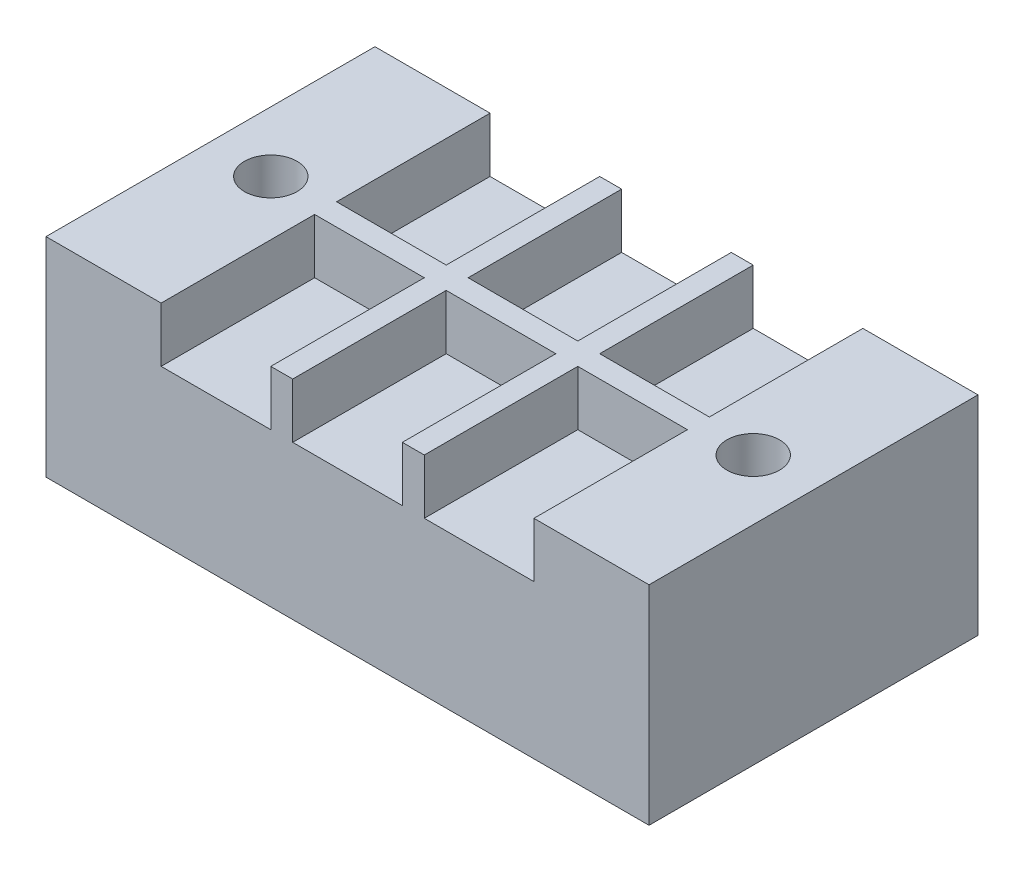
ISO-10303-21;
HEADER;
FILE_DESCRIPTION(('STEP AP214'),'2;1');
FILE_NAME('part.step','',(''),(''),'','','');
FILE_SCHEMA(('AUTOMOTIVE_DESIGN { 1 0 10303 214 1 1 1 1 }'));
ENDSEC;
DATA;
#1=APPLICATION_CONTEXT('core data for automotive mechanical design processes');
#2=APPLICATION_PROTOCOL_DEFINITION('international standard','automotive_design',2000,#1);
#3=PRODUCT_CONTEXT('',#1,'mechanical');
#4=PRODUCT('Part','Part','',(#3));
#5=PRODUCT_RELATED_PRODUCT_CATEGORY('part','',(#4));
#6=PRODUCT_DEFINITION_FORMATION('','',#4);
#7=PRODUCT_DEFINITION_CONTEXT('part definition',#1,'design');
#8=PRODUCT_DEFINITION('design','',#6,#7);
#9=PRODUCT_DEFINITION_SHAPE('','',#8);
#10=(LENGTH_UNIT() NAMED_UNIT(*) SI_UNIT(.MILLI.,.METRE.));
#11=(NAMED_UNIT(*) PLANE_ANGLE_UNIT() SI_UNIT($,.RADIAN.));
#12=(NAMED_UNIT(*) SI_UNIT($,.STERADIAN.) SOLID_ANGLE_UNIT());
#13=UNCERTAINTY_MEASURE_WITH_UNIT(LENGTH_MEASURE(1.E-05),#10,'distance_accuracy_value','');
#14=(GEOMETRIC_REPRESENTATION_CONTEXT(3) GLOBAL_UNCERTAINTY_ASSIGNED_CONTEXT((#13)) GLOBAL_UNIT_ASSIGNED_CONTEXT((#10,
#11,#12)) REPRESENTATION_CONTEXT('',''));
#15=CARTESIAN_POINT('',(0.,0.,0.));
#16=DIRECTION('',(0.,0.,1.));
#17=DIRECTION('',(1.,0.,0.));
#18=AXIS2_PLACEMENT_3D('',#15,#16,#17);
#19=CARTESIAN_POINT('',(27.5,19.,15.));
#20=DIRECTION('',(-1.,0.,0.));
#21=DIRECTION('',(0.,0.,1.));
#22=AXIS2_PLACEMENT_3D('',#19,#20,#21);
#23=PLANE('',#22);
#24=DIRECTION('',(0.,0.,-1.));
#25=VECTOR('',#24,1.);
#26=CARTESIAN_POINT('',(27.5,0.,15.));
#27=LINE('',#26,#25);
#28=CARTESIAN_POINT('',(27.5,0.,15.));
#29=VERTEX_POINT('',#28);
#30=CARTESIAN_POINT('',(27.5,0.,-15.));
#31=VERTEX_POINT('',#30);
#32=EDGE_CURVE('E407',#29,#31,#27,.T.);
#33=ORIENTED_EDGE('',*,*,#32,.T.);
#34=DIRECTION('',(0.,-1.,0.));
#35=VECTOR('',#34,1.);
#36=CARTESIAN_POINT('',(27.5,19.,-15.));
#37=LINE('',#36,#35);
#38=CARTESIAN_POINT('',(27.5,19.,-15.));
#39=VERTEX_POINT('',#38);
#40=EDGE_CURVE('E11',#39,#31,#37,.T.);
#41=ORIENTED_EDGE('',*,*,#40,.F.);
#42=DIRECTION('',(0.,0.,-1.));
#43=VECTOR('',#42,1.);
#44=CARTESIAN_POINT('',(27.5,19.,15.));
#45=LINE('',#44,#43);
#46=CARTESIAN_POINT('',(27.5,19.,15.));
#47=VERTEX_POINT('',#46);
#48=EDGE_CURVE('E410',#47,#39,#45,.T.);
#49=ORIENTED_EDGE('',*,*,#48,.F.);
#50=DIRECTION('',(0.,-1.,0.));
#51=VECTOR('',#50,1.);
#52=CARTESIAN_POINT('',(27.5,19.,15.));
#53=LINE('',#52,#51);
#54=EDGE_CURVE('E427',#47,#29,#53,.T.);
#55=ORIENTED_EDGE('',*,*,#54,.T.);
#56=EDGE_LOOP('',(#33,#41,#49,#55));
#57=FACE_BOUND('',#56,.T.);
#58=ADVANCED_FACE('F34',(#57),#23,.F.);
#59=CARTESIAN_POINT('',(27.5,19.,-15.));
#60=DIRECTION('',(0.,0.,1.));
#61=DIRECTION('',(1.,0.,0.));
#62=AXIS2_PLACEMENT_3D('',#59,#60,#61);
#63=PLANE('',#62);
#64=DIRECTION('',(-1.,0.,0.));
#65=VECTOR('',#64,1.);
#66=CARTESIAN_POINT('',(27.5,19.,-15.));
#67=LINE('',#66,#65);
#68=CARTESIAN_POINT('',(-5.,19.,-15.));
#69=VERTEX_POINT('',#68);
#70=CARTESIAN_POINT('',(-7.,19.,-15.));
#71=VERTEX_POINT('',#70);
#72=EDGE_CURVE('E420',#69,#71,#67,.T.);
#73=ORIENTED_EDGE('',*,*,#72,.F.);
#74=DIRECTION('',(0.,1.,0.));
#75=VECTOR('',#74,1.);
#76=CARTESIAN_POINT('',(-5.,14.,-15.));
#77=LINE('',#76,#75);
#78=CARTESIAN_POINT('',(-5.,14.,-15.));
#79=VERTEX_POINT('',#78);
#80=EDGE_CURVE('E248',#79,#69,#77,.T.);
#81=ORIENTED_EDGE('',*,*,#80,.F.);
#82=DIRECTION('',(-1.,0.,0.));
#83=VECTOR('',#82,1.);
#84=CARTESIAN_POINT('',(-5.,14.,-15.));
#85=LINE('',#84,#83);
#86=CARTESIAN_POINT('',(5.,14.,-15.));
#87=VERTEX_POINT('',#86);
#88=EDGE_CURVE('E225',#87,#79,#85,.T.);
#89=ORIENTED_EDGE('',*,*,#88,.F.);
#90=DIRECTION('',(0.,1.,0.));
#91=VECTOR('',#90,1.);
#92=CARTESIAN_POINT('',(5.,14.,-15.));
#93=LINE('',#92,#91);
#94=CARTESIAN_POINT('',(5.,19.,-15.));
#95=VERTEX_POINT('',#94);
#96=EDGE_CURVE('E251',#87,#95,#93,.T.);
#97=ORIENTED_EDGE('',*,*,#96,.T.);
#98=CARTESIAN_POINT('',(7.,19.,-15.));
#99=VERTEX_POINT('',#98);
#100=EDGE_CURVE('E419',#99,#95,#67,.T.);
#101=ORIENTED_EDGE('',*,*,#100,.F.);
#102=DIRECTION('',(0.,1.,0.));
#103=VECTOR('',#102,1.);
#104=CARTESIAN_POINT('',(7.,14.,-15.));
#105=LINE('',#104,#103);
#106=CARTESIAN_POINT('',(7.,14.,-15.));
#107=VERTEX_POINT('',#106);
#108=EDGE_CURVE('E246',#107,#99,#105,.T.);
#109=ORIENTED_EDGE('',*,*,#108,.F.);
#110=DIRECTION('',(-1.,0.,0.));
#111=VECTOR('',#110,1.);
#112=CARTESIAN_POINT('',(7.,14.,-15.));
#113=LINE('',#112,#111);
#114=CARTESIAN_POINT('',(17.,14.,-15.));
#115=VERTEX_POINT('',#114);
#116=EDGE_CURVE('E265',#115,#107,#113,.T.);
#117=ORIENTED_EDGE('',*,*,#116,.F.);
#118=DIRECTION('',(0.,1.,0.));
#119=VECTOR('',#118,1.);
#120=CARTESIAN_POINT('',(17.,14.,-15.));
#121=LINE('',#120,#119);
#122=CARTESIAN_POINT('',(17.,19.,-15.));
#123=VERTEX_POINT('',#122);
#124=EDGE_CURVE('E276',#115,#123,#121,.T.);
#125=ORIENTED_EDGE('',*,*,#124,.T.);
#126=EDGE_CURVE('E415',#39,#123,#67,.T.);
#127=ORIENTED_EDGE('',*,*,#126,.F.);
#128=ORIENTED_EDGE('',*,*,#40,.T.);
#129=DIRECTION('',(-1.,0.,0.));
#130=VECTOR('',#129,1.);
#131=CARTESIAN_POINT('',(27.5,0.,-15.));
#132=LINE('',#131,#130);
#133=CARTESIAN_POINT('',(-27.5,0.,-15.));
#134=VERTEX_POINT('',#133);
#135=EDGE_CURVE('E431',#31,#134,#132,.T.);
#136=ORIENTED_EDGE('',*,*,#135,.T.);
#137=DIRECTION('',(0.,-1.,0.));
#138=VECTOR('',#137,1.);
#139=CARTESIAN_POINT('',(-27.5,19.,-15.));
#140=LINE('',#139,#138);
#141=CARTESIAN_POINT('',(-27.5,19.,-15.));
#142=VERTEX_POINT('',#141);
#143=EDGE_CURVE('E41',#142,#134,#140,.T.);
#144=ORIENTED_EDGE('',*,*,#143,.F.);
#145=CARTESIAN_POINT('',(-17.,19.,-15.));
#146=VERTEX_POINT('',#145);
#147=EDGE_CURVE('E413',#146,#142,#67,.T.);
#148=ORIENTED_EDGE('',*,*,#147,.F.);
#149=DIRECTION('',(0.,1.,0.));
#150=VECTOR('',#149,1.);
#151=CARTESIAN_POINT('',(-17.,14.,-15.));
#152=LINE('',#151,#150);
#153=CARTESIAN_POINT('',(-17.,14.,-15.));
#154=VERTEX_POINT('',#153);
#155=EDGE_CURVE('E388',#154,#146,#152,.T.);
#156=ORIENTED_EDGE('',*,*,#155,.F.);
#157=DIRECTION('',(-1.,0.,0.));
#158=VECTOR('',#157,1.);
#159=CARTESIAN_POINT('',(-17.,14.,-15.));
#160=LINE('',#159,#158);
#161=CARTESIAN_POINT('',(-7.,14.,-15.));
#162=VERTEX_POINT('',#161);
#163=EDGE_CURVE('E378',#162,#154,#160,.T.);
#164=ORIENTED_EDGE('',*,*,#163,.F.);
#165=DIRECTION('',(0.,1.,0.));
#166=VECTOR('',#165,1.);
#167=CARTESIAN_POINT('',(-7.,14.,-15.));
#168=LINE('',#167,#166);
#169=EDGE_CURVE('E391',#162,#71,#168,.T.);
#170=ORIENTED_EDGE('',*,*,#169,.T.);
#171=EDGE_LOOP('',(#73,#81,#89,#97,#101,#109,#117,#125,#127,#128,#136,#144,#148,#156,#164,#170));
#172=FACE_BOUND('',#171,.T.);
#173=ADVANCED_FACE('F450',(#172),#63,.F.);
#174=CARTESIAN_POINT('',(-27.5,19.,15.));
#175=DIRECTION('',(-1.,0.,0.));
#176=DIRECTION('',(0.,0.,1.));
#177=AXIS2_PLACEMENT_3D('',#174,#175,#176);
#178=PLANE('',#177);
#179=DIRECTION('',(0.,0.,-1.));
#180=VECTOR('',#179,1.);
#181=CARTESIAN_POINT('',(-27.5,0.,15.));
#182=LINE('',#181,#180);
#183=CARTESIAN_POINT('',(-27.5,0.,15.));
#184=VERTEX_POINT('',#183);
#185=EDGE_CURVE('E434',#184,#134,#182,.T.);
#186=ORIENTED_EDGE('',*,*,#185,.F.);
#187=DIRECTION('',(0.,-1.,0.));
#188=VECTOR('',#187,1.);
#189=CARTESIAN_POINT('',(-27.5,19.,15.));
#190=LINE('',#189,#188);
#191=CARTESIAN_POINT('',(-27.5,19.,15.));
#192=VERTEX_POINT('',#191);
#193=EDGE_CURVE('E440',#192,#184,#190,.T.);
#194=ORIENTED_EDGE('',*,*,#193,.F.);
#195=DIRECTION('',(0.,0.,-1.));
#196=VECTOR('',#195,1.);
#197=CARTESIAN_POINT('',(-27.5,19.,15.));
#198=LINE('',#197,#196);
#199=EDGE_CURVE('E418',#192,#142,#198,.T.);
#200=ORIENTED_EDGE('',*,*,#199,.T.);
#201=ORIENTED_EDGE('',*,*,#143,.T.);
#202=EDGE_LOOP('',(#186,#194,#200,#201));
#203=FACE_BOUND('',#202,.T.);
#204=ADVANCED_FACE('F444',(#203),#178,.T.);
#205=CARTESIAN_POINT('',(27.5,19.,15.));
#206=DIRECTION('',(0.,0.,1.));
#207=DIRECTION('',(1.,0.,0.));
#208=AXIS2_PLACEMENT_3D('',#205,#206,#207);
#209=PLANE('',#208);
#210=DIRECTION('',(0.,1.,0.));
#211=VECTOR('',#210,1.);
#212=CARTESIAN_POINT('',(7.,14.,15.));
#213=LINE('',#212,#211);
#214=CARTESIAN_POINT('',(7.,14.,15.));
#215=VERTEX_POINT('',#214);
#216=CARTESIAN_POINT('',(7.,19.,15.));
#217=VERTEX_POINT('',#216);
#218=EDGE_CURVE('E271',#215,#217,#213,.T.);
#219=ORIENTED_EDGE('',*,*,#218,.T.);
#220=DIRECTION('',(-1.,0.,0.));
#221=VECTOR('',#220,1.);
#222=CARTESIAN_POINT('',(27.5,19.,15.));
#223=LINE('',#222,#221);
#224=CARTESIAN_POINT('',(5.,19.,15.));
#225=VERTEX_POINT('',#224);
#226=EDGE_CURVE('E428',#217,#225,#223,.T.);
#227=ORIENTED_EDGE('',*,*,#226,.T.);
#228=DIRECTION('',(0.,1.,0.));
#229=VECTOR('',#228,1.);
#230=CARTESIAN_POINT('',(5.,14.,15.));
#231=LINE('',#230,#229);
#232=CARTESIAN_POINT('',(5.,14.,15.));
#233=VERTEX_POINT('',#232);
#234=EDGE_CURVE('E324',#233,#225,#231,.T.);
#235=ORIENTED_EDGE('',*,*,#234,.F.);
#236=DIRECTION('',(1.,0.,0.));
#237=VECTOR('',#236,1.);
#238=CARTESIAN_POINT('',(-5.,14.,15.));
#239=LINE('',#238,#237);
#240=CARTESIAN_POINT('',(-5.,14.,15.));
#241=VERTEX_POINT('',#240);
#242=EDGE_CURVE('E311',#241,#233,#239,.T.);
#243=ORIENTED_EDGE('',*,*,#242,.F.);
#244=DIRECTION('',(0.,1.,0.));
#245=VECTOR('',#244,1.);
#246=CARTESIAN_POINT('',(-5.,14.,15.));
#247=LINE('',#246,#245);
#248=CARTESIAN_POINT('',(-5.,19.,15.));
#249=VERTEX_POINT('',#248);
#250=EDGE_CURVE('E300',#241,#249,#247,.T.);
#251=ORIENTED_EDGE('',*,*,#250,.T.);
#252=CARTESIAN_POINT('',(-7.,19.,15.));
#253=VERTEX_POINT('',#252);
#254=EDGE_CURVE('E523',#249,#253,#223,.T.);
#255=ORIENTED_EDGE('',*,*,#254,.T.);
#256=DIRECTION('',(0.,1.,0.));
#257=VECTOR('',#256,1.);
#258=CARTESIAN_POINT('',(-7.,14.,15.));
#259=LINE('',#258,#257);
#260=CARTESIAN_POINT('',(-7.,14.,15.));
#261=VERTEX_POINT('',#260);
#262=EDGE_CURVE('E353',#261,#253,#259,.T.);
#263=ORIENTED_EDGE('',*,*,#262,.F.);
#264=DIRECTION('',(1.,0.,0.));
#265=VECTOR('',#264,1.);
#266=CARTESIAN_POINT('',(-17.,14.,15.));
#267=LINE('',#266,#265);
#268=CARTESIAN_POINT('',(-17.,14.,15.));
#269=VERTEX_POINT('',#268);
#270=EDGE_CURVE('E340',#269,#261,#267,.T.);
#271=ORIENTED_EDGE('',*,*,#270,.F.);
#272=DIRECTION('',(0.,1.,0.));
#273=VECTOR('',#272,1.);
#274=CARTESIAN_POINT('',(-17.,14.,15.));
#275=LINE('',#274,#273);
#276=CARTESIAN_POINT('',(-17.,19.,15.));
#277=VERTEX_POINT('',#276);
#278=EDGE_CURVE('E329',#269,#277,#275,.T.);
#279=ORIENTED_EDGE('',*,*,#278,.T.);
#280=EDGE_CURVE('E423',#277,#192,#223,.T.);
#281=ORIENTED_EDGE('',*,*,#280,.T.);
#282=ORIENTED_EDGE('',*,*,#193,.T.);
#283=DIRECTION('',(-1.,0.,0.));
#284=VECTOR('',#283,1.);
#285=CARTESIAN_POINT('',(27.5,0.,15.));
#286=LINE('',#285,#284);
#287=EDGE_CURVE('E414',#29,#184,#286,.T.);
#288=ORIENTED_EDGE('',*,*,#287,.F.);
#289=ORIENTED_EDGE('',*,*,#54,.F.);
#290=CARTESIAN_POINT('',(17.,19.,15.));
#291=VERTEX_POINT('',#290);
#292=EDGE_CURVE('E424',#47,#291,#223,.T.);
#293=ORIENTED_EDGE('',*,*,#292,.T.);
#294=DIRECTION('',(0.,1.,0.));
#295=VECTOR('',#294,1.);
#296=CARTESIAN_POINT('',(17.,14.,15.));
#297=LINE('',#296,#295);
#298=CARTESIAN_POINT('',(17.,14.,15.));
#299=VERTEX_POINT('',#298);
#300=EDGE_CURVE('E295',#299,#291,#297,.T.);
#301=ORIENTED_EDGE('',*,*,#300,.F.);
#302=DIRECTION('',(1.,0.,0.));
#303=VECTOR('',#302,1.);
#304=CARTESIAN_POINT('',(7.,14.,15.));
#305=LINE('',#304,#303);
#306=EDGE_CURVE('E282',#215,#299,#305,.T.);
#307=ORIENTED_EDGE('',*,*,#306,.F.);
#308=EDGE_LOOP('',(#219,#227,#235,#243,#251,#255,#263,#271,#279,#281,#282,#288,#289,#293,#301,#307));
#309=FACE_BOUND('',#308,.T.);
#310=ADVANCED_FACE('F457',(#309),#209,.T.);
#311=CARTESIAN_POINT('',(0.,19.,0.));
#312=DIRECTION('',(0.,1.,0.));
#313=DIRECTION('',(0.,0.,1.));
#314=AXIS2_PLACEMENT_3D('',#311,#312,#313);
#315=PLANE('',#314);
#316=DIRECTION('',(0.,0.,1.));
#317=VECTOR('',#316,1.);
#318=CARTESIAN_POINT('',(-5.,19.,-15.));
#319=LINE('',#318,#317);
#320=CARTESIAN_POINT('',(-5.,19.,-1.));
#321=VERTEX_POINT('',#320);
#322=EDGE_CURVE('E48',#69,#321,#319,.T.);
#323=ORIENTED_EDGE('',*,*,#322,.F.);
#324=ORIENTED_EDGE('',*,*,#72,.T.);
#325=DIRECTION('',(0.,0.,-1.));
#326=VECTOR('',#325,1.);
#327=CARTESIAN_POINT('',(-7.,19.,-15.));
#328=LINE('',#327,#326);
#329=CARTESIAN_POINT('',(-7.,19.,-1.));
#330=VERTEX_POINT('',#329);
#331=EDGE_CURVE('E372',#330,#71,#328,.T.);
#332=ORIENTED_EDGE('',*,*,#331,.F.);
#333=DIRECTION('',(1.,0.,0.));
#334=VECTOR('',#333,1.);
#335=CARTESIAN_POINT('',(-17.,19.,-1.));
#336=LINE('',#335,#334);
#337=CARTESIAN_POINT('',(-17.,19.,-1.));
#338=VERTEX_POINT('',#337);
#339=EDGE_CURVE('E383',#338,#330,#336,.T.);
#340=ORIENTED_EDGE('',*,*,#339,.F.);
#341=DIRECTION('',(0.,0.,1.));
#342=VECTOR('',#341,1.);
#343=CARTESIAN_POINT('',(-17.,19.,-15.));
#344=LINE('',#343,#342);
#345=EDGE_CURVE('E250',#146,#338,#344,.T.);
#346=ORIENTED_EDGE('',*,*,#345,.F.);
#347=ORIENTED_EDGE('',*,*,#147,.T.);
#348=ORIENTED_EDGE('',*,*,#199,.F.);
#349=ORIENTED_EDGE('',*,*,#280,.F.);
#350=DIRECTION('',(0.,0.,1.));
#351=VECTOR('',#350,1.);
#352=CARTESIAN_POINT('',(-17.,19.,15.));
#353=LINE('',#352,#351);
#354=CARTESIAN_POINT('',(-17.,19.,1.));
#355=VERTEX_POINT('',#354);
#356=EDGE_CURVE('E344',#355,#277,#353,.T.);
#357=ORIENTED_EDGE('',*,*,#356,.F.);
#358=DIRECTION('',(-1.,0.,0.));
#359=VECTOR('',#358,1.);
#360=CARTESIAN_POINT('',(-17.,19.,1.));
#361=LINE('',#360,#359);
#362=CARTESIAN_POINT('',(-7.,19.,1.));
#363=VERTEX_POINT('',#362);
#364=EDGE_CURVE('E357',#363,#355,#361,.T.);
#365=ORIENTED_EDGE('',*,*,#364,.F.);
#366=DIRECTION('',(0.,0.,-1.));
#367=VECTOR('',#366,1.);
#368=CARTESIAN_POINT('',(-7.,19.,15.));
#369=LINE('',#368,#367);
#370=EDGE_CURVE('E354',#253,#363,#369,.T.);
#371=ORIENTED_EDGE('',*,*,#370,.F.);
#372=ORIENTED_EDGE('',*,*,#254,.F.);
#373=DIRECTION('',(0.,0.,1.));
#374=VECTOR('',#373,1.);
#375=CARTESIAN_POINT('',(-5.,19.,15.));
#376=LINE('',#375,#374);
#377=CARTESIAN_POINT('',(-5.,19.,1.));
#378=VERTEX_POINT('',#377);
#379=EDGE_CURVE('E315',#378,#249,#376,.T.);
#380=ORIENTED_EDGE('',*,*,#379,.F.);
#381=DIRECTION('',(-1.,0.,0.));
#382=VECTOR('',#381,1.);
#383=CARTESIAN_POINT('',(-5.,19.,1.));
#384=LINE('',#383,#382);
#385=CARTESIAN_POINT('',(5.,19.,1.));
#386=VERTEX_POINT('',#385);
#387=EDGE_CURVE('E328',#386,#378,#384,.T.);
#388=ORIENTED_EDGE('',*,*,#387,.F.);
#389=DIRECTION('',(0.,0.,-1.));
#390=VECTOR('',#389,1.);
#391=CARTESIAN_POINT('',(5.,19.,15.));
#392=LINE('',#391,#390);
#393=EDGE_CURVE('E325',#225,#386,#392,.T.);
#394=ORIENTED_EDGE('',*,*,#393,.F.);
#395=ORIENTED_EDGE('',*,*,#226,.F.);
#396=DIRECTION('',(0.,0.,1.));
#397=VECTOR('',#396,1.);
#398=CARTESIAN_POINT('',(7.,19.,15.));
#399=LINE('',#398,#397);
#400=CARTESIAN_POINT('',(7.,19.,1.));
#401=VERTEX_POINT('',#400);
#402=EDGE_CURVE('E286',#401,#217,#399,.T.);
#403=ORIENTED_EDGE('',*,*,#402,.F.);
#404=DIRECTION('',(-1.,0.,0.));
#405=VECTOR('',#404,1.);
#406=CARTESIAN_POINT('',(7.,19.,1.));
#407=LINE('',#406,#405);
#408=CARTESIAN_POINT('',(17.,19.,1.));
#409=VERTEX_POINT('',#408);
#410=EDGE_CURVE('E299',#409,#401,#407,.T.);
#411=ORIENTED_EDGE('',*,*,#410,.F.);
#412=DIRECTION('',(0.,0.,-1.));
#413=VECTOR('',#412,1.);
#414=CARTESIAN_POINT('',(17.,19.,15.));
#415=LINE('',#414,#413);
#416=EDGE_CURVE('E296',#291,#409,#415,.T.);
#417=ORIENTED_EDGE('',*,*,#416,.F.);
#418=ORIENTED_EDGE('',*,*,#292,.F.);
#419=ORIENTED_EDGE('',*,*,#48,.T.);
#420=ORIENTED_EDGE('',*,*,#126,.T.);
#421=DIRECTION('',(0.,0.,-1.));
#422=VECTOR('',#421,1.);
#423=CARTESIAN_POINT('',(17.,19.,-15.));
#424=LINE('',#423,#422);
#425=CARTESIAN_POINT('',(17.,19.,-1.));
#426=VERTEX_POINT('',#425);
#427=EDGE_CURVE('E259',#426,#123,#424,.T.);
#428=ORIENTED_EDGE('',*,*,#427,.F.);
#429=DIRECTION('',(1.,0.,0.));
#430=VECTOR('',#429,1.);
#431=CARTESIAN_POINT('',(7.,19.,-1.));
#432=LINE('',#431,#430);
#433=CARTESIAN_POINT('',(7.,19.,-1.));
#434=VERTEX_POINT('',#433);
#435=EDGE_CURVE('E270',#434,#426,#432,.T.);
#436=ORIENTED_EDGE('',*,*,#435,.F.);
#437=DIRECTION('',(0.,0.,1.));
#438=VECTOR('',#437,1.);
#439=CARTESIAN_POINT('',(7.,19.,-15.));
#440=LINE('',#439,#438);
#441=EDGE_CURVE('E56',#99,#434,#440,.T.);
#442=ORIENTED_EDGE('',*,*,#441,.F.);
#443=ORIENTED_EDGE('',*,*,#100,.T.);
#444=DIRECTION('',(0.,0.,-1.));
#445=VECTOR('',#444,1.);
#446=CARTESIAN_POINT('',(5.,19.,-15.));
#447=LINE('',#446,#445);
#448=CARTESIAN_POINT('',(5.,19.,-1.));
#449=VERTEX_POINT('',#448);
#450=EDGE_CURVE('E238',#449,#95,#447,.T.);
#451=ORIENTED_EDGE('',*,*,#450,.F.);
#452=DIRECTION('',(1.,0.,0.));
#453=VECTOR('',#452,1.);
#454=CARTESIAN_POINT('',(-5.,19.,-1.));
#455=LINE('',#454,#453);
#456=EDGE_CURVE('E240',#321,#449,#455,.T.);
#457=ORIENTED_EDGE('',*,*,#456,.F.);
#458=EDGE_LOOP('',(#323,#324,#332,#340,#346,#347,#348,#349,#357,#365,#371,#372,#380,#388,#394,
#395,#403,#411,#417,#418,#419,#420,#428,#436,#442,#443,#451,#457));
#459=FACE_BOUND('',#458,.T.);
#460=CARTESIAN_POINT('',(22.,19.,0.));
#461=DIRECTION('',(0.,1.,0.));
#462=DIRECTION('',(0.,0.,-1.));
#463=AXIS2_PLACEMENT_3D('',#460,#461,#462);
#464=CIRCLE('',#463,2.4);
#465=CARTESIAN_POINT('',(22.,19.,-2.4));
#466=VERTEX_POINT('',#465);
#467=EDGE_CURVE('E390',#466,#466,#464,.T.);
#468=ORIENTED_EDGE('',*,*,#467,.F.);
#469=EDGE_LOOP('',(#468));
#470=FACE_BOUND('',#469,.T.);
#471=CARTESIAN_POINT('',(-22.,19.,0.));
#472=DIRECTION('',(0.,1.,0.));
#473=DIRECTION('',(0.,0.,1.));
#474=AXIS2_PLACEMENT_3D('',#471,#472,#473);
#475=CIRCLE('',#474,2.4);
#476=CARTESIAN_POINT('',(-22.,19.,2.4));
#477=VERTEX_POINT('',#476);
#478=EDGE_CURVE('E401',#477,#477,#475,.T.);
#479=ORIENTED_EDGE('',*,*,#478,.F.);
#480=EDGE_LOOP('',(#479));
#481=FACE_BOUND('',#480,.T.);
#482=ADVANCED_FACE('F461',(#459,#470,#481),#315,.T.);
#483=CARTESIAN_POINT('',(0.,0.,0.));
#484=DIRECTION('',(0.,1.,0.));
#485=DIRECTION('',(0.,0.,1.));
#486=AXIS2_PLACEMENT_3D('',#483,#484,#485);
#487=PLANE('',#486);
#488=CARTESIAN_POINT('',(22.,0.,0.));
#489=DIRECTION('',(0.,1.,0.));
#490=DIRECTION('',(0.,0.,-1.));
#491=AXIS2_PLACEMENT_3D('',#488,#489,#490);
#492=CIRCLE('',#491,2.4);
#493=CARTESIAN_POINT('',(22.,0.,-2.4));
#494=VERTEX_POINT('',#493);
#495=EDGE_CURVE('E398',#494,#494,#492,.T.);
#496=ORIENTED_EDGE('',*,*,#495,.T.);
#497=EDGE_LOOP('',(#496));
#498=FACE_BOUND('',#497,.T.);
#499=CARTESIAN_POINT('',(-22.,0.,0.));
#500=DIRECTION('',(0.,1.,0.));
#501=DIRECTION('',(0.,0.,1.));
#502=AXIS2_PLACEMENT_3D('',#499,#500,#501);
#503=CIRCLE('',#502,2.4);
#504=CARTESIAN_POINT('',(-22.,0.,2.4));
#505=VERTEX_POINT('',#504);
#506=EDGE_CURVE('E404',#505,#505,#503,.T.);
#507=ORIENTED_EDGE('',*,*,#506,.T.);
#508=EDGE_LOOP('',(#507));
#509=FACE_BOUND('',#508,.T.);
#510=ORIENTED_EDGE('',*,*,#32,.F.);
#511=ORIENTED_EDGE('',*,*,#287,.T.);
#512=ORIENTED_EDGE('',*,*,#185,.T.);
#513=ORIENTED_EDGE('',*,*,#135,.F.);
#514=EDGE_LOOP('',(#510,#511,#512,#513));
#515=FACE_BOUND('',#514,.T.);
#516=ADVANCED_FACE('F454',(#498,#509,#515),#487,.F.);
#517=CARTESIAN_POINT('',(-22.,0.,0.));
#518=DIRECTION('',(0.,1.,0.));
#519=DIRECTION('',(0.,0.,1.));
#520=AXIS2_PLACEMENT_3D('',#517,#518,#519);
#521=CYLINDRICAL_SURFACE('',#520,2.4);
#522=ORIENTED_EDGE('',*,*,#506,.F.);
#523=EDGE_LOOP('',(#522));
#524=FACE_BOUND('',#523,.T.);
#525=ORIENTED_EDGE('',*,*,#478,.T.);
#526=EDGE_LOOP('',(#525));
#527=FACE_BOUND('',#526,.T.);
#528=ADVANCED_FACE('F495',(#524,#527),#521,.F.);
#529=CARTESIAN_POINT('',(22.,0.,0.));
#530=DIRECTION('',(0.,1.,0.));
#531=DIRECTION('',(0.,0.,1.));
#532=AXIS2_PLACEMENT_3D('',#529,#530,#531);
#533=CYLINDRICAL_SURFACE('',#532,2.4);
#534=ORIENTED_EDGE('',*,*,#495,.F.);
#535=EDGE_LOOP('',(#534));
#536=FACE_BOUND('',#535,.T.);
#537=ORIENTED_EDGE('',*,*,#467,.T.);
#538=EDGE_LOOP('',(#537));
#539=FACE_BOUND('',#538,.T.);
#540=ADVANCED_FACE('F488',(#536,#539),#533,.F.);
#541=CARTESIAN_POINT('',(-17.,14.,-15.));
#542=DIRECTION('',(-1.,0.,0.));
#543=DIRECTION('',(0.,0.,1.));
#544=AXIS2_PLACEMENT_3D('',#541,#542,#543);
#545=PLANE('',#544);
#546=ORIENTED_EDGE('',*,*,#345,.T.);
#547=DIRECTION('',(0.,1.,0.));
#548=VECTOR('',#547,1.);
#549=CARTESIAN_POINT('',(-17.,14.,-1.));
#550=LINE('',#549,#548);
#551=CARTESIAN_POINT('',(-17.,14.,-1.));
#552=VERTEX_POINT('',#551);
#553=EDGE_CURVE('E381',#552,#338,#550,.T.);
#554=ORIENTED_EDGE('',*,*,#553,.F.);
#555=DIRECTION('',(0.,0.,1.));
#556=VECTOR('',#555,1.);
#557=CARTESIAN_POINT('',(-17.,14.,-15.));
#558=LINE('',#557,#556);
#559=EDGE_CURVE('E368',#154,#552,#558,.T.);
#560=ORIENTED_EDGE('',*,*,#559,.F.);
#561=ORIENTED_EDGE('',*,*,#155,.T.);
#562=EDGE_LOOP('',(#546,#554,#560,#561));
#563=FACE_BOUND('',#562,.T.);
#564=ADVANCED_FACE('F486',(#563),#545,.F.);
#565=CARTESIAN_POINT('',(-7.,14.,-15.));
#566=DIRECTION('',(1.,0.,0.));
#567=DIRECTION('',(0.,0.,-1.));
#568=AXIS2_PLACEMENT_3D('',#565,#566,#567);
#569=PLANE('',#568);
#570=ORIENTED_EDGE('',*,*,#331,.T.);
#571=ORIENTED_EDGE('',*,*,#169,.F.);
#572=DIRECTION('',(0.,0.,-1.));
#573=VECTOR('',#572,1.);
#574=CARTESIAN_POINT('',(-7.,14.,-15.));
#575=LINE('',#574,#573);
#576=CARTESIAN_POINT('',(-7.,14.,-1.));
#577=VERTEX_POINT('',#576);
#578=EDGE_CURVE('E375',#577,#162,#575,.T.);
#579=ORIENTED_EDGE('',*,*,#578,.F.);
#580=DIRECTION('',(0.,1.,0.));
#581=VECTOR('',#580,1.);
#582=CARTESIAN_POINT('',(-7.,14.,-1.));
#583=LINE('',#582,#581);
#584=EDGE_CURVE('E394',#577,#330,#583,.T.);
#585=ORIENTED_EDGE('',*,*,#584,.T.);
#586=EDGE_LOOP('',(#570,#571,#579,#585));
#587=FACE_BOUND('',#586,.T.);
#588=ADVANCED_FACE('F479',(#587),#569,.F.);
#589=CARTESIAN_POINT('',(-17.,14.,-1.));
#590=DIRECTION('',(0.,0.,1.));
#591=DIRECTION('',(1.,0.,0.));
#592=AXIS2_PLACEMENT_3D('',#589,#590,#591);
#593=PLANE('',#592);
#594=ORIENTED_EDGE('',*,*,#339,.T.);
#595=ORIENTED_EDGE('',*,*,#584,.F.);
#596=DIRECTION('',(1.,0.,0.));
#597=VECTOR('',#596,1.);
#598=CARTESIAN_POINT('',(-17.,14.,-1.));
#599=LINE('',#598,#597);
#600=EDGE_CURVE('E371',#552,#577,#599,.T.);
#601=ORIENTED_EDGE('',*,*,#600,.F.);
#602=ORIENTED_EDGE('',*,*,#553,.T.);
#603=EDGE_LOOP('',(#594,#595,#601,#602));
#604=FACE_BOUND('',#603,.T.);
#605=ADVANCED_FACE('F484',(#604),#593,.F.);
#606=CARTESIAN_POINT('',(0.,14.,0.));
#607=DIRECTION('',(0.,1.,0.));
#608=DIRECTION('',(0.,0.,1.));
#609=AXIS2_PLACEMENT_3D('',#606,#607,#608);
#610=PLANE('',#609);
#611=ORIENTED_EDGE('',*,*,#559,.T.);
#612=ORIENTED_EDGE('',*,*,#600,.T.);
#613=ORIENTED_EDGE('',*,*,#578,.T.);
#614=ORIENTED_EDGE('',*,*,#163,.T.);
#615=EDGE_LOOP('',(#611,#612,#613,#614));
#616=FACE_BOUND('',#615,.T.);
#617=ADVANCED_FACE('F481',(#616),#610,.T.);
#618=CARTESIAN_POINT('',(-17.,14.,15.));
#619=DIRECTION('',(-1.,0.,0.));
#620=DIRECTION('',(0.,0.,1.));
#621=AXIS2_PLACEMENT_3D('',#618,#619,#620);
#622=PLANE('',#621);
#623=ORIENTED_EDGE('',*,*,#356,.T.);
#624=ORIENTED_EDGE('',*,*,#278,.F.);
#625=DIRECTION('',(0.,0.,1.));
#626=VECTOR('',#625,1.);
#627=CARTESIAN_POINT('',(-17.,14.,15.));
#628=LINE('',#627,#626);
#629=CARTESIAN_POINT('',(-17.,14.,1.));
#630=VERTEX_POINT('',#629);
#631=EDGE_CURVE('E350',#630,#269,#628,.T.);
#632=ORIENTED_EDGE('',*,*,#631,.F.);
#633=DIRECTION('',(0.,1.,0.));
#634=VECTOR('',#633,1.);
#635=CARTESIAN_POINT('',(-17.,14.,1.));
#636=LINE('',#635,#634);
#637=EDGE_CURVE('E363',#630,#355,#636,.T.);
#638=ORIENTED_EDGE('',*,*,#637,.T.);
#639=EDGE_LOOP('',(#623,#624,#632,#638));
#640=FACE_BOUND('',#639,.T.);
#641=ADVANCED_FACE('F539',(#640),#622,.F.);
#642=CARTESIAN_POINT('',(-17.,14.,1.));
#643=DIRECTION('',(0.,0.,-1.));
#644=DIRECTION('',(-1.,0.,0.));
#645=AXIS2_PLACEMENT_3D('',#642,#643,#644);
#646=PLANE('',#645);
#647=ORIENTED_EDGE('',*,*,#364,.T.);
#648=ORIENTED_EDGE('',*,*,#637,.F.);
#649=DIRECTION('',(-1.,0.,0.));
#650=VECTOR('',#649,1.);
#651=CARTESIAN_POINT('',(-17.,14.,1.));
#652=LINE('',#651,#650);
#653=CARTESIAN_POINT('',(-7.,14.,1.));
#654=VERTEX_POINT('',#653);
#655=EDGE_CURVE('E347',#654,#630,#652,.T.);
#656=ORIENTED_EDGE('',*,*,#655,.F.);
#657=DIRECTION('',(0.,1.,0.));
#658=VECTOR('',#657,1.);
#659=CARTESIAN_POINT('',(-7.,14.,1.));
#660=LINE('',#659,#658);
#661=EDGE_CURVE('E365',#654,#363,#660,.T.);
#662=ORIENTED_EDGE('',*,*,#661,.T.);
#663=EDGE_LOOP('',(#647,#648,#656,#662));
#664=FACE_BOUND('',#663,.T.);
#665=ADVANCED_FACE('F541',(#664),#646,.F.);
#666=CARTESIAN_POINT('',(-7.,14.,15.));
#667=DIRECTION('',(1.,0.,0.));
#668=DIRECTION('',(0.,0.,-1.));
#669=AXIS2_PLACEMENT_3D('',#666,#667,#668);
#670=PLANE('',#669);
#671=ORIENTED_EDGE('',*,*,#370,.T.);
#672=ORIENTED_EDGE('',*,*,#661,.F.);
#673=DIRECTION('',(0.,0.,-1.));
#674=VECTOR('',#673,1.);
#675=CARTESIAN_POINT('',(-7.,14.,15.));
#676=LINE('',#675,#674);
#677=EDGE_CURVE('E343',#261,#654,#676,.T.);
#678=ORIENTED_EDGE('',*,*,#677,.F.);
#679=ORIENTED_EDGE('',*,*,#262,.T.);
#680=EDGE_LOOP('',(#671,#672,#678,#679));
#681=FACE_BOUND('',#680,.T.);
#682=ADVANCED_FACE('F533',(#681),#670,.F.);
#683=CARTESIAN_POINT('',(0.,14.,0.));
#684=DIRECTION('',(0.,1.,0.));
#685=DIRECTION('',(0.,0.,1.));
#686=AXIS2_PLACEMENT_3D('',#683,#684,#685);
#687=PLANE('',#686);
#688=ORIENTED_EDGE('',*,*,#270,.T.);
#689=ORIENTED_EDGE('',*,*,#677,.T.);
#690=ORIENTED_EDGE('',*,*,#655,.T.);
#691=ORIENTED_EDGE('',*,*,#631,.T.);
#692=EDGE_LOOP('',(#688,#689,#690,#691));
#693=FACE_BOUND('',#692,.T.);
#694=ADVANCED_FACE('F536',(#693),#687,.T.);
#695=CARTESIAN_POINT('',(-5.,14.,15.));
#696=DIRECTION('',(-1.,0.,0.));
#697=DIRECTION('',(0.,0.,1.));
#698=AXIS2_PLACEMENT_3D('',#695,#696,#697);
#699=PLANE('',#698);
#700=ORIENTED_EDGE('',*,*,#379,.T.);
#701=ORIENTED_EDGE('',*,*,#250,.F.);
#702=DIRECTION('',(0.,0.,1.));
#703=VECTOR('',#702,1.);
#704=CARTESIAN_POINT('',(-5.,14.,15.));
#705=LINE('',#704,#703);
#706=CARTESIAN_POINT('',(-5.,14.,1.));
#707=VERTEX_POINT('',#706);
#708=EDGE_CURVE('E321',#707,#241,#705,.T.);
#709=ORIENTED_EDGE('',*,*,#708,.F.);
#710=DIRECTION('',(0.,1.,0.));
#711=VECTOR('',#710,1.);
#712=CARTESIAN_POINT('',(-5.,14.,1.));
#713=LINE('',#712,#711);
#714=EDGE_CURVE('E335',#707,#378,#713,.T.);
#715=ORIENTED_EDGE('',*,*,#714,.T.);
#716=EDGE_LOOP('',(#700,#701,#709,#715));
#717=FACE_BOUND('',#716,.T.);
#718=ADVANCED_FACE('F585',(#717),#699,.F.);
#719=CARTESIAN_POINT('',(-5.,14.,1.));
#720=DIRECTION('',(0.,0.,-1.));
#721=DIRECTION('',(-1.,0.,0.));
#722=AXIS2_PLACEMENT_3D('',#719,#720,#721);
#723=PLANE('',#722);
#724=ORIENTED_EDGE('',*,*,#387,.T.);
#725=ORIENTED_EDGE('',*,*,#714,.F.);
#726=DIRECTION('',(-1.,0.,0.));
#727=VECTOR('',#726,1.);
#728=CARTESIAN_POINT('',(-5.,14.,1.));
#729=LINE('',#728,#727);
#730=CARTESIAN_POINT('',(5.,14.,1.));
#731=VERTEX_POINT('',#730);
#732=EDGE_CURVE('E318',#731,#707,#729,.T.);
#733=ORIENTED_EDGE('',*,*,#732,.F.);
#734=DIRECTION('',(0.,1.,0.));
#735=VECTOR('',#734,1.);
#736=CARTESIAN_POINT('',(5.,14.,1.));
#737=LINE('',#736,#735);
#738=EDGE_CURVE('E337',#731,#386,#737,.T.);
#739=ORIENTED_EDGE('',*,*,#738,.T.);
#740=EDGE_LOOP('',(#724,#725,#733,#739));
#741=FACE_BOUND('',#740,.T.);
#742=ADVANCED_FACE('F593',(#741),#723,.F.);
#743=CARTESIAN_POINT('',(5.,14.,15.));
#744=DIRECTION('',(1.,0.,0.));
#745=DIRECTION('',(0.,0.,-1.));
#746=AXIS2_PLACEMENT_3D('',#743,#744,#745);
#747=PLANE('',#746);
#748=ORIENTED_EDGE('',*,*,#393,.T.);
#749=ORIENTED_EDGE('',*,*,#738,.F.);
#750=DIRECTION('',(0.,0.,-1.));
#751=VECTOR('',#750,1.);
#752=CARTESIAN_POINT('',(5.,14.,15.));
#753=LINE('',#752,#751);
#754=EDGE_CURVE('E314',#233,#731,#753,.T.);
#755=ORIENTED_EDGE('',*,*,#754,.F.);
#756=ORIENTED_EDGE('',*,*,#234,.T.);
#757=EDGE_LOOP('',(#748,#749,#755,#756));
#758=FACE_BOUND('',#757,.T.);
#759=ADVANCED_FACE('F603',(#758),#747,.F.);
#760=CARTESIAN_POINT('',(0.,14.,0.));
#761=DIRECTION('',(0.,1.,0.));
#762=DIRECTION('',(0.,0.,1.));
#763=AXIS2_PLACEMENT_3D('',#760,#761,#762);
#764=PLANE('',#763);
#765=ORIENTED_EDGE('',*,*,#242,.T.);
#766=ORIENTED_EDGE('',*,*,#754,.T.);
#767=ORIENTED_EDGE('',*,*,#732,.T.);
#768=ORIENTED_EDGE('',*,*,#708,.T.);
#769=EDGE_LOOP('',(#765,#766,#767,#768));
#770=FACE_BOUND('',#769,.T.);
#771=ADVANCED_FACE('F613',(#770),#764,.T.);
#772=CARTESIAN_POINT('',(7.,14.,15.));
#773=DIRECTION('',(-1.,0.,0.));
#774=DIRECTION('',(0.,0.,1.));
#775=AXIS2_PLACEMENT_3D('',#772,#773,#774);
#776=PLANE('',#775);
#777=ORIENTED_EDGE('',*,*,#402,.T.);
#778=ORIENTED_EDGE('',*,*,#218,.F.);
#779=DIRECTION('',(0.,0.,1.));
#780=VECTOR('',#779,1.);
#781=CARTESIAN_POINT('',(7.,14.,15.));
#782=LINE('',#781,#780);
#783=CARTESIAN_POINT('',(7.,14.,1.));
#784=VERTEX_POINT('',#783);
#785=EDGE_CURVE('E292',#784,#215,#782,.T.);
#786=ORIENTED_EDGE('',*,*,#785,.F.);
#787=DIRECTION('',(0.,1.,0.));
#788=VECTOR('',#787,1.);
#789=CARTESIAN_POINT('',(7.,14.,1.));
#790=LINE('',#789,#788);
#791=EDGE_CURVE('E306',#784,#401,#790,.T.);
#792=ORIENTED_EDGE('',*,*,#791,.T.);
#793=EDGE_LOOP('',(#777,#778,#786,#792));
#794=FACE_BOUND('',#793,.T.);
#795=ADVANCED_FACE('F516',(#794),#776,.F.);
#796=CARTESIAN_POINT('',(7.,14.,1.));
#797=DIRECTION('',(0.,0.,-1.));
#798=DIRECTION('',(-1.,0.,0.));
#799=AXIS2_PLACEMENT_3D('',#796,#797,#798);
#800=PLANE('',#799);
#801=ORIENTED_EDGE('',*,*,#410,.T.);
#802=ORIENTED_EDGE('',*,*,#791,.F.);
#803=DIRECTION('',(-1.,0.,0.));
#804=VECTOR('',#803,1.);
#805=CARTESIAN_POINT('',(7.,14.,1.));
#806=LINE('',#805,#804);
#807=CARTESIAN_POINT('',(17.,14.,1.));
#808=VERTEX_POINT('',#807);
#809=EDGE_CURVE('E289',#808,#784,#806,.T.);
#810=ORIENTED_EDGE('',*,*,#809,.F.);
#811=DIRECTION('',(0.,1.,0.));
#812=VECTOR('',#811,1.);
#813=CARTESIAN_POINT('',(17.,14.,1.));
#814=LINE('',#813,#812);
#815=EDGE_CURVE('E308',#808,#409,#814,.T.);
#816=ORIENTED_EDGE('',*,*,#815,.T.);
#817=EDGE_LOOP('',(#801,#802,#810,#816));
#818=FACE_BOUND('',#817,.T.);
#819=ADVANCED_FACE('F632',(#818),#800,.F.);
#820=CARTESIAN_POINT('',(17.,14.,15.));
#821=DIRECTION('',(1.,0.,0.));
#822=DIRECTION('',(0.,0.,-1.));
#823=AXIS2_PLACEMENT_3D('',#820,#821,#822);
#824=PLANE('',#823);
#825=ORIENTED_EDGE('',*,*,#416,.T.);
#826=ORIENTED_EDGE('',*,*,#815,.F.);
#827=DIRECTION('',(0.,0.,-1.));
#828=VECTOR('',#827,1.);
#829=CARTESIAN_POINT('',(17.,14.,15.));
#830=LINE('',#829,#828);
#831=EDGE_CURVE('E285',#299,#808,#830,.T.);
#832=ORIENTED_EDGE('',*,*,#831,.F.);
#833=ORIENTED_EDGE('',*,*,#300,.T.);
#834=EDGE_LOOP('',(#825,#826,#832,#833));
#835=FACE_BOUND('',#834,.T.);
#836=ADVANCED_FACE('F510',(#835),#824,.F.);
#837=CARTESIAN_POINT('',(0.,14.,0.));
#838=DIRECTION('',(0.,1.,0.));
#839=DIRECTION('',(0.,0.,1.));
#840=AXIS2_PLACEMENT_3D('',#837,#838,#839);
#841=PLANE('',#840);
#842=ORIENTED_EDGE('',*,*,#306,.T.);
#843=ORIENTED_EDGE('',*,*,#831,.T.);
#844=ORIENTED_EDGE('',*,*,#809,.T.);
#845=ORIENTED_EDGE('',*,*,#785,.T.);
#846=EDGE_LOOP('',(#842,#843,#844,#845));
#847=FACE_BOUND('',#846,.T.);
#848=ADVANCED_FACE('F513',(#847),#841,.T.);
#849=CARTESIAN_POINT('',(7.,14.,-15.));
#850=DIRECTION('',(-1.,0.,0.));
#851=DIRECTION('',(0.,0.,1.));
#852=AXIS2_PLACEMENT_3D('',#849,#850,#851);
#853=PLANE('',#852);
#854=ORIENTED_EDGE('',*,*,#441,.T.);
#855=DIRECTION('',(0.,1.,0.));
#856=VECTOR('',#855,1.);
#857=CARTESIAN_POINT('',(7.,14.,-1.));
#858=LINE('',#857,#856);
#859=CARTESIAN_POINT('',(7.,14.,-1.));
#860=VERTEX_POINT('',#859);
#861=EDGE_CURVE('E268',#860,#434,#858,.T.);
#862=ORIENTED_EDGE('',*,*,#861,.F.);
#863=DIRECTION('',(0.,0.,1.));
#864=VECTOR('',#863,1.);
#865=CARTESIAN_POINT('',(7.,14.,-15.));
#866=LINE('',#865,#864);
#867=EDGE_CURVE('E255',#107,#860,#866,.T.);
#868=ORIENTED_EDGE('',*,*,#867,.F.);
#869=ORIENTED_EDGE('',*,*,#108,.T.);
#870=EDGE_LOOP('',(#854,#862,#868,#869));
#871=FACE_BOUND('',#870,.T.);
#872=ADVANCED_FACE('F658',(#871),#853,.F.);
#873=CARTESIAN_POINT('',(17.,14.,-15.));
#874=DIRECTION('',(1.,0.,0.));
#875=DIRECTION('',(0.,0.,-1.));
#876=AXIS2_PLACEMENT_3D('',#873,#874,#875);
#877=PLANE('',#876);
#878=ORIENTED_EDGE('',*,*,#427,.T.);
#879=ORIENTED_EDGE('',*,*,#124,.F.);
#880=DIRECTION('',(0.,0.,-1.));
#881=VECTOR('',#880,1.);
#882=CARTESIAN_POINT('',(17.,14.,-15.));
#883=LINE('',#882,#881);
#884=CARTESIAN_POINT('',(17.,14.,-1.));
#885=VERTEX_POINT('',#884);
#886=EDGE_CURVE('E262',#885,#115,#883,.T.);
#887=ORIENTED_EDGE('',*,*,#886,.F.);
#888=DIRECTION('',(0.,1.,0.));
#889=VECTOR('',#888,1.);
#890=CARTESIAN_POINT('',(17.,14.,-1.));
#891=LINE('',#890,#889);
#892=EDGE_CURVE('E279',#885,#426,#891,.T.);
#893=ORIENTED_EDGE('',*,*,#892,.T.);
#894=EDGE_LOOP('',(#878,#879,#887,#893));
#895=FACE_BOUND('',#894,.T.);
#896=ADVANCED_FACE('F667',(#895),#877,.F.);
#897=CARTESIAN_POINT('',(7.,14.,-1.));
#898=DIRECTION('',(0.,0.,1.));
#899=DIRECTION('',(1.,0.,0.));
#900=AXIS2_PLACEMENT_3D('',#897,#898,#899);
#901=PLANE('',#900);
#902=ORIENTED_EDGE('',*,*,#435,.T.);
#903=ORIENTED_EDGE('',*,*,#892,.F.);
#904=DIRECTION('',(1.,0.,0.));
#905=VECTOR('',#904,1.);
#906=CARTESIAN_POINT('',(7.,14.,-1.));
#907=LINE('',#906,#905);
#908=EDGE_CURVE('E258',#860,#885,#907,.T.);
#909=ORIENTED_EDGE('',*,*,#908,.F.);
#910=ORIENTED_EDGE('',*,*,#861,.T.);
#911=EDGE_LOOP('',(#902,#903,#909,#910));
#912=FACE_BOUND('',#911,.T.);
#913=ADVANCED_FACE('F676',(#912),#901,.F.);
#914=CARTESIAN_POINT('',(0.,14.,0.));
#915=DIRECTION('',(0.,1.,0.));
#916=DIRECTION('',(0.,0.,1.));
#917=AXIS2_PLACEMENT_3D('',#914,#915,#916);
#918=PLANE('',#917);
#919=ORIENTED_EDGE('',*,*,#867,.T.);
#920=ORIENTED_EDGE('',*,*,#908,.T.);
#921=ORIENTED_EDGE('',*,*,#886,.T.);
#922=ORIENTED_EDGE('',*,*,#116,.T.);
#923=EDGE_LOOP('',(#919,#920,#921,#922));
#924=FACE_BOUND('',#923,.T.);
#925=ADVANCED_FACE('F686',(#924),#918,.T.);
#926=CARTESIAN_POINT('',(-5.,14.,-15.));
#927=DIRECTION('',(-1.,0.,0.));
#928=DIRECTION('',(0.,0.,1.));
#929=AXIS2_PLACEMENT_3D('',#926,#927,#928);
#930=PLANE('',#929);
#931=ORIENTED_EDGE('',*,*,#322,.T.);
#932=DIRECTION('',(0.,1.,0.));
#933=VECTOR('',#932,1.);
#934=CARTESIAN_POINT('',(-5.,14.,-1.));
#935=LINE('',#934,#933);
#936=CARTESIAN_POINT('',(-5.,14.,-1.));
#937=VERTEX_POINT('',#936);
#938=EDGE_CURVE('E215',#937,#321,#935,.T.);
#939=ORIENTED_EDGE('',*,*,#938,.F.);
#940=DIRECTION('',(0.,0.,1.));
#941=VECTOR('',#940,1.);
#942=CARTESIAN_POINT('',(-5.,14.,-15.));
#943=LINE('',#942,#941);
#944=EDGE_CURVE('E219',#79,#937,#943,.T.);
#945=ORIENTED_EDGE('',*,*,#944,.F.);
#946=ORIENTED_EDGE('',*,*,#80,.T.);
#947=EDGE_LOOP('',(#931,#939,#945,#946));
#948=FACE_BOUND('',#947,.T.);
#949=ADVANCED_FACE('F217',(#948),#930,.F.);
#950=CARTESIAN_POINT('',(5.,14.,-15.));
#951=DIRECTION('',(1.,0.,0.));
#952=DIRECTION('',(0.,0.,-1.));
#953=AXIS2_PLACEMENT_3D('',#950,#951,#952);
#954=PLANE('',#953);
#955=ORIENTED_EDGE('',*,*,#450,.T.);
#956=ORIENTED_EDGE('',*,*,#96,.F.);
#957=DIRECTION('',(0.,0.,-1.));
#958=VECTOR('',#957,1.);
#959=CARTESIAN_POINT('',(5.,14.,-15.));
#960=LINE('',#959,#958);
#961=CARTESIAN_POINT('',(5.,14.,-1.));
#962=VERTEX_POINT('',#961);
#963=EDGE_CURVE('E233',#962,#87,#960,.T.);
#964=ORIENTED_EDGE('',*,*,#963,.F.);
#965=DIRECTION('',(0.,1.,0.));
#966=VECTOR('',#965,1.);
#967=CARTESIAN_POINT('',(5.,14.,-1.));
#968=LINE('',#967,#966);
#969=EDGE_CURVE('E224',#962,#449,#968,.T.);
#970=ORIENTED_EDGE('',*,*,#969,.T.);
#971=EDGE_LOOP('',(#955,#956,#964,#970));
#972=FACE_BOUND('',#971,.T.);
#973=ADVANCED_FACE('F474',(#972),#954,.F.);
#974=CARTESIAN_POINT('',(-5.,14.,-1.));
#975=DIRECTION('',(0.,0.,1.));
#976=DIRECTION('',(1.,0.,0.));
#977=AXIS2_PLACEMENT_3D('',#974,#975,#976);
#978=PLANE('',#977);
#979=ORIENTED_EDGE('',*,*,#456,.T.);
#980=ORIENTED_EDGE('',*,*,#969,.F.);
#981=DIRECTION('',(1.,0.,0.));
#982=VECTOR('',#981,1.);
#983=CARTESIAN_POINT('',(-5.,14.,-1.));
#984=LINE('',#983,#982);
#985=EDGE_CURVE('E228',#937,#962,#984,.T.);
#986=ORIENTED_EDGE('',*,*,#985,.F.);
#987=ORIENTED_EDGE('',*,*,#938,.T.);
#988=EDGE_LOOP('',(#979,#980,#986,#987));
#989=FACE_BOUND('',#988,.T.);
#990=ADVANCED_FACE('F229',(#989),#978,.F.);
#991=CARTESIAN_POINT('',(0.,14.,0.));
#992=DIRECTION('',(0.,1.,0.));
#993=DIRECTION('',(0.,0.,1.));
#994=AXIS2_PLACEMENT_3D('',#991,#992,#993);
#995=PLANE('',#994);
#996=ORIENTED_EDGE('',*,*,#944,.T.);
#997=ORIENTED_EDGE('',*,*,#985,.T.);
#998=ORIENTED_EDGE('',*,*,#963,.T.);
#999=ORIENTED_EDGE('',*,*,#88,.T.);
#1000=EDGE_LOOP('',(#996,#997,#998,#999));
#1001=FACE_BOUND('',#1000,.T.);
#1002=ADVANCED_FACE('F235',(#1001),#995,.T.);
#1003=CLOSED_SHELL('',(#58,#173,#204,#310,#482,#516,#528,#540,#564,#588,#605,#617,#641,#665,
#682,#694,#718,#742,#759,#771,#795,#819,#836,#848,#872,#896,#913,#925,#949,#973,#990,#1002));
#1004=MANIFOLD_SOLID_BREP('B2',#1003);
#1005=ADVANCED_BREP_SHAPE_REPRESENTATION('',(#18,#1004),#14);
#1006=SHAPE_DEFINITION_REPRESENTATION(#9,#1005);
ENDSEC;
END-ISO-10303-21;
